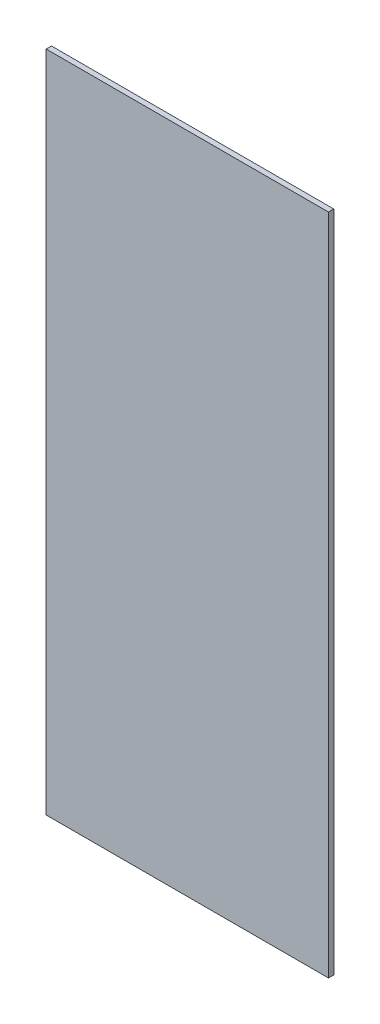
ISO-10303-21;
HEADER;
FILE_DESCRIPTION(('STEP AP214'),'2;1');
FILE_NAME('part.step','',(''),(''),'','','');
FILE_SCHEMA(('AUTOMOTIVE_DESIGN { 1 0 10303 214 1 1 1 1 }'));
ENDSEC;
DATA;
#1=APPLICATION_CONTEXT('core data for automotive mechanical design processes');
#2=APPLICATION_PROTOCOL_DEFINITION('international standard','automotive_design',2000,#1);
#3=PRODUCT_CONTEXT('',#1,'mechanical');
#4=PRODUCT('Part','Part','',(#3));
#5=PRODUCT_RELATED_PRODUCT_CATEGORY('part','',(#4));
#6=PRODUCT_DEFINITION_FORMATION('','',#4);
#7=PRODUCT_DEFINITION_CONTEXT('part definition',#1,'design');
#8=PRODUCT_DEFINITION('design','',#6,#7);
#9=PRODUCT_DEFINITION_SHAPE('','',#8);
#10=(LENGTH_UNIT() NAMED_UNIT(*) SI_UNIT(.MILLI.,.METRE.));
#11=(NAMED_UNIT(*) PLANE_ANGLE_UNIT() SI_UNIT($,.RADIAN.));
#12=(NAMED_UNIT(*) SI_UNIT($,.STERADIAN.) SOLID_ANGLE_UNIT());
#13=UNCERTAINTY_MEASURE_WITH_UNIT(LENGTH_MEASURE(1.E-05),#10,'distance_accuracy_value','');
#14=(GEOMETRIC_REPRESENTATION_CONTEXT(3) GLOBAL_UNCERTAINTY_ASSIGNED_CONTEXT((#13)) GLOBAL_UNIT_ASSIGNED_CONTEXT((#10,
#11,#12)) REPRESENTATION_CONTEXT('',''));
#15=CARTESIAN_POINT('',(0.,0.,0.));
#16=DIRECTION('',(0.,0.,1.));
#17=DIRECTION('',(1.,0.,0.));
#18=AXIS2_PLACEMENT_3D('',#15,#16,#17);
#19=CARTESIAN_POINT('',(160.,-376.,6.));
#20=DIRECTION('',(-1.,0.,0.));
#21=DIRECTION('',(0.,0.,1.));
#22=AXIS2_PLACEMENT_3D('',#19,#20,#21);
#23=PLANE('',#22);
#24=DIRECTION('',(0.,1.,0.));
#25=VECTOR('',#24,1.);
#26=CARTESIAN_POINT('',(160.,-376.,0.));
#27=LINE('',#26,#25);
#28=CARTESIAN_POINT('',(160.,-376.,0.));
#29=VERTEX_POINT('',#28);
#30=CARTESIAN_POINT('',(160.,376.,0.));
#31=VERTEX_POINT('',#30);
#32=EDGE_CURVE('E96',#29,#31,#27,.T.);
#33=ORIENTED_EDGE('',*,*,#32,.T.);
#34=DIRECTION('',(0.,0.,-1.));
#35=VECTOR('',#34,1.);
#36=CARTESIAN_POINT('',(160.,376.,6.));
#37=LINE('',#36,#35);
#38=CARTESIAN_POINT('',(160.,376.,6.));
#39=VERTEX_POINT('',#38);
#40=EDGE_CURVE('E11',#39,#31,#37,.T.);
#41=ORIENTED_EDGE('',*,*,#40,.F.);
#42=DIRECTION('',(0.,1.,0.));
#43=VECTOR('',#42,1.);
#44=CARTESIAN_POINT('',(160.,-376.,6.));
#45=LINE('',#44,#43);
#46=CARTESIAN_POINT('',(160.,-376.,6.));
#47=VERTEX_POINT('',#46);
#48=EDGE_CURVE('E84',#47,#39,#45,.T.);
#49=ORIENTED_EDGE('',*,*,#48,.F.);
#50=DIRECTION('',(0.,0.,-1.));
#51=VECTOR('',#50,1.);
#52=CARTESIAN_POINT('',(160.,-376.,6.));
#53=LINE('',#52,#51);
#54=EDGE_CURVE('E92',#47,#29,#53,.T.);
#55=ORIENTED_EDGE('',*,*,#54,.T.);
#56=EDGE_LOOP('',(#33,#41,#49,#55));
#57=FACE_BOUND('',#56,.T.);
#58=ADVANCED_FACE('F33',(#57),#23,.F.);
#59=CARTESIAN_POINT('',(-160.,376.,6.));
#60=DIRECTION('',(0.,-1.,0.));
#61=DIRECTION('',(0.,0.,-1.));
#62=AXIS2_PLACEMENT_3D('',#59,#60,#61);
#63=PLANE('',#62);
#64=DIRECTION('',(-1.,0.,0.));
#65=VECTOR('',#64,1.);
#66=CARTESIAN_POINT('',(-160.,376.,0.));
#67=LINE('',#66,#65);
#68=CARTESIAN_POINT('',(-160.,376.,0.));
#69=VERTEX_POINT('',#68);
#70=EDGE_CURVE('E88',#31,#69,#67,.T.);
#71=ORIENTED_EDGE('',*,*,#70,.T.);
#72=DIRECTION('',(0.,0.,-1.));
#73=VECTOR('',#72,1.);
#74=CARTESIAN_POINT('',(-160.,376.,6.));
#75=LINE('',#74,#73);
#76=CARTESIAN_POINT('',(-160.,376.,6.));
#77=VERTEX_POINT('',#76);
#78=EDGE_CURVE('E41',#77,#69,#75,.T.);
#79=ORIENTED_EDGE('',*,*,#78,.F.);
#80=DIRECTION('',(-1.,0.,0.));
#81=VECTOR('',#80,1.);
#82=CARTESIAN_POINT('',(-160.,376.,6.));
#83=LINE('',#82,#81);
#84=EDGE_CURVE('E79',#39,#77,#83,.T.);
#85=ORIENTED_EDGE('',*,*,#84,.F.);
#86=ORIENTED_EDGE('',*,*,#40,.T.);
#87=EDGE_LOOP('',(#71,#79,#85,#86));
#88=FACE_BOUND('',#87,.T.);
#89=ADVANCED_FACE('F87',(#88),#63,.F.);
#90=CARTESIAN_POINT('',(-160.,-376.,6.));
#91=DIRECTION('',(1.,0.,0.));
#92=DIRECTION('',(0.,0.,-1.));
#93=AXIS2_PLACEMENT_3D('',#90,#91,#92);
#94=PLANE('',#93);
#95=DIRECTION('',(0.,-1.,0.));
#96=VECTOR('',#95,1.);
#97=CARTESIAN_POINT('',(-160.,-376.,0.));
#98=LINE('',#97,#96);
#99=CARTESIAN_POINT('',(-160.,-376.,0.));
#100=VERTEX_POINT('',#99);
#101=EDGE_CURVE('E66',#69,#100,#98,.T.);
#102=ORIENTED_EDGE('',*,*,#101,.T.);
#103=DIRECTION('',(0.,0.,-1.));
#104=VECTOR('',#103,1.);
#105=CARTESIAN_POINT('',(-160.,-376.,6.));
#106=LINE('',#105,#104);
#107=CARTESIAN_POINT('',(-160.,-376.,6.));
#108=VERTEX_POINT('',#107);
#109=EDGE_CURVE('E89',#108,#100,#106,.T.);
#110=ORIENTED_EDGE('',*,*,#109,.F.);
#111=DIRECTION('',(0.,-1.,0.));
#112=VECTOR('',#111,1.);
#113=CARTESIAN_POINT('',(-160.,-376.,6.));
#114=LINE('',#113,#112);
#115=EDGE_CURVE('E82',#77,#108,#114,.T.);
#116=ORIENTED_EDGE('',*,*,#115,.F.);
#117=ORIENTED_EDGE('',*,*,#78,.T.);
#118=EDGE_LOOP('',(#102,#110,#116,#117));
#119=FACE_BOUND('',#118,.T.);
#120=ADVANCED_FACE('F90',(#119),#94,.F.);
#121=CARTESIAN_POINT('',(-160.,-376.,6.));
#122=DIRECTION('',(0.,1.,0.));
#123=DIRECTION('',(0.,0.,1.));
#124=AXIS2_PLACEMENT_3D('',#121,#122,#123);
#125=PLANE('',#124);
#126=DIRECTION('',(1.,0.,0.));
#127=VECTOR('',#126,1.);
#128=CARTESIAN_POINT('',(-160.,-376.,0.));
#129=LINE('',#128,#127);
#130=EDGE_CURVE('E72',#100,#29,#129,.T.);
#131=ORIENTED_EDGE('',*,*,#130,.T.);
#132=ORIENTED_EDGE('',*,*,#54,.F.);
#133=DIRECTION('',(1.,0.,0.));
#134=VECTOR('',#133,1.);
#135=CARTESIAN_POINT('',(-160.,-376.,6.));
#136=LINE('',#135,#134);
#137=EDGE_CURVE('E49',#108,#47,#136,.T.);
#138=ORIENTED_EDGE('',*,*,#137,.F.);
#139=ORIENTED_EDGE('',*,*,#109,.T.);
#140=EDGE_LOOP('',(#131,#132,#138,#139));
#141=FACE_BOUND('',#140,.T.);
#142=ADVANCED_FACE('F103',(#141),#125,.F.);
#143=CARTESIAN_POINT('',(0.,0.,6.));
#144=DIRECTION('',(0.,0.,-1.));
#145=DIRECTION('',(-1.,0.,0.));
#146=AXIS2_PLACEMENT_3D('',#143,#144,#145);
#147=PLANE('',#146);
#148=ORIENTED_EDGE('',*,*,#48,.T.);
#149=ORIENTED_EDGE('',*,*,#84,.T.);
#150=ORIENTED_EDGE('',*,*,#115,.T.);
#151=ORIENTED_EDGE('',*,*,#137,.T.);
#152=EDGE_LOOP('',(#148,#149,#150,#151));
#153=FACE_BOUND('',#152,.T.);
#154=ADVANCED_FACE('F80',(#153),#147,.F.);
#155=CARTESIAN_POINT('',(0.,0.,0.));
#156=DIRECTION('',(0.,0.,-1.));
#157=DIRECTION('',(-1.,0.,0.));
#158=AXIS2_PLACEMENT_3D('',#155,#156,#157);
#159=PLANE('',#158);
#160=ORIENTED_EDGE('',*,*,#32,.F.);
#161=ORIENTED_EDGE('',*,*,#130,.F.);
#162=ORIENTED_EDGE('',*,*,#101,.F.);
#163=ORIENTED_EDGE('',*,*,#70,.F.);
#164=EDGE_LOOP('',(#160,#161,#162,#163));
#165=FACE_BOUND('',#164,.T.);
#166=ADVANCED_FACE('F106',(#165),#159,.T.);
#167=CLOSED_SHELL('',(#58,#89,#120,#142,#154,#166));
#168=MANIFOLD_SOLID_BREP('B2',#167);
#169=ADVANCED_BREP_SHAPE_REPRESENTATION('',(#18,#168),#14);
#170=SHAPE_DEFINITION_REPRESENTATION(#9,#169);
ENDSEC;
END-ISO-10303-21;
